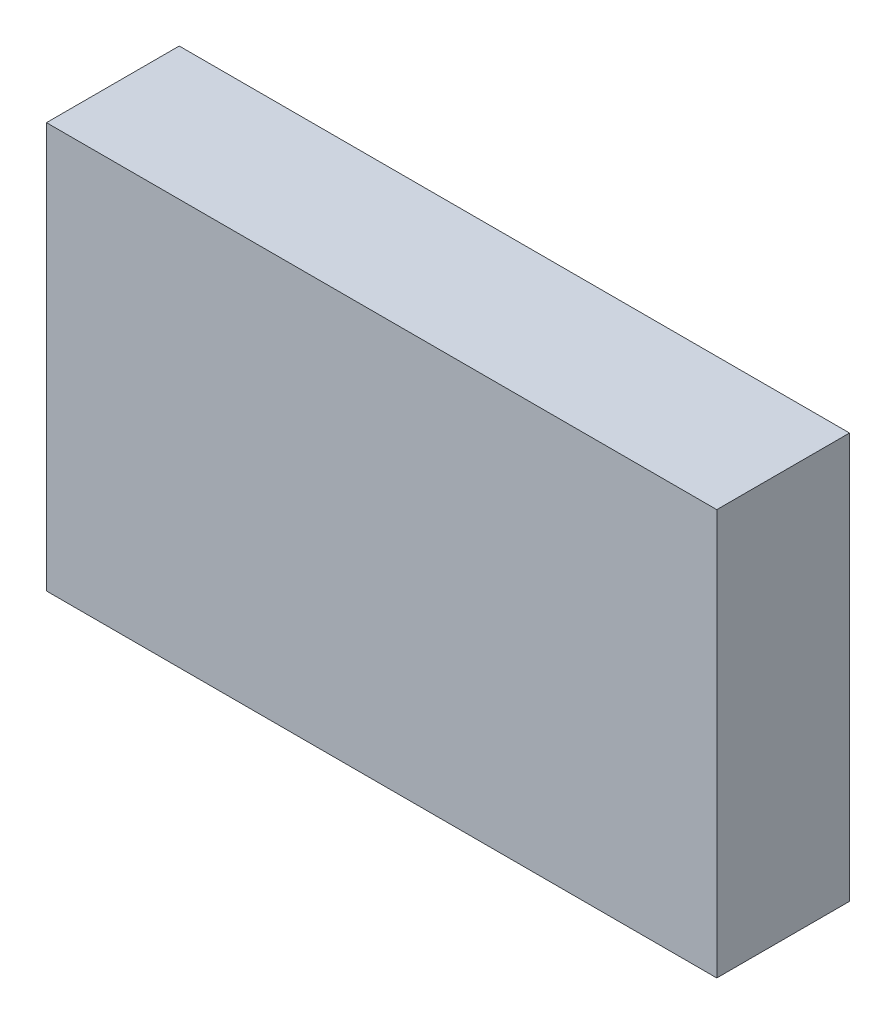
ISO-10303-21;
HEADER;
FILE_DESCRIPTION(('STEP AP214'),'2;1');
FILE_NAME('part.step','',(''),(''),'','','');
FILE_SCHEMA(('AUTOMOTIVE_DESIGN { 1 0 10303 214 1 1 1 1 }'));
ENDSEC;
DATA;
#1=APPLICATION_CONTEXT('core data for automotive mechanical design processes');
#2=APPLICATION_PROTOCOL_DEFINITION('international standard','automotive_design',2000,#1);
#3=PRODUCT_CONTEXT('',#1,'mechanical');
#4=PRODUCT('Part','Part','',(#3));
#5=PRODUCT_RELATED_PRODUCT_CATEGORY('part','',(#4));
#6=PRODUCT_DEFINITION_FORMATION('','',#4);
#7=PRODUCT_DEFINITION_CONTEXT('part definition',#1,'design');
#8=PRODUCT_DEFINITION('design','',#6,#7);
#9=PRODUCT_DEFINITION_SHAPE('','',#8);
#10=(LENGTH_UNIT() NAMED_UNIT(*) SI_UNIT(.MILLI.,.METRE.));
#11=(NAMED_UNIT(*) PLANE_ANGLE_UNIT() SI_UNIT($,.RADIAN.));
#12=(NAMED_UNIT(*) SI_UNIT($,.STERADIAN.) SOLID_ANGLE_UNIT());
#13=UNCERTAINTY_MEASURE_WITH_UNIT(LENGTH_MEASURE(1.E-05),#10,'distance_accuracy_value','');
#14=(GEOMETRIC_REPRESENTATION_CONTEXT(3) GLOBAL_UNCERTAINTY_ASSIGNED_CONTEXT((#13)) GLOBAL_UNIT_ASSIGNED_CONTEXT((#10,
#11,#12)) REPRESENTATION_CONTEXT('',''));
#15=CARTESIAN_POINT('',(0.,0.,0.));
#16=DIRECTION('',(0.,0.,1.));
#17=DIRECTION('',(1.,0.,0.));
#18=AXIS2_PLACEMENT_3D('',#15,#16,#17);
#19=CARTESIAN_POINT('',(0.,0.,16.2));
#20=DIRECTION('',(1.,0.,0.));
#21=DIRECTION('',(0.,0.,-1.));
#22=AXIS2_PLACEMENT_3D('',#19,#20,#21);
#23=PLANE('',#22);
#24=DIRECTION('',(0.,-1.,0.));
#25=VECTOR('',#24,1.);
#26=CARTESIAN_POINT('',(0.,0.,0.));
#27=LINE('',#26,#25);
#28=CARTESIAN_POINT('',(0.,49.5,0.));
#29=VERTEX_POINT('',#28);
#30=CARTESIAN_POINT('',(0.,0.,0.));
#31=VERTEX_POINT('',#30);
#32=EDGE_CURVE('E107',#29,#31,#27,.T.);
#33=ORIENTED_EDGE('',*,*,#32,.T.);
#34=DIRECTION('',(0.,0.,-1.));
#35=VECTOR('',#34,1.);
#36=CARTESIAN_POINT('',(0.,0.,16.2));
#37=LINE('',#36,#35);
#38=CARTESIAN_POINT('',(0.,0.,16.2));
#39=VERTEX_POINT('',#38);
#40=EDGE_CURVE('E11',#39,#31,#37,.T.);
#41=ORIENTED_EDGE('',*,*,#40,.F.);
#42=DIRECTION('',(0.,-1.,0.));
#43=VECTOR('',#42,1.);
#44=CARTESIAN_POINT('',(0.,0.,16.2));
#45=LINE('',#44,#43);
#46=CARTESIAN_POINT('',(0.,49.5,16.2));
#47=VERTEX_POINT('',#46);
#48=EDGE_CURVE('E91',#47,#39,#45,.T.);
#49=ORIENTED_EDGE('',*,*,#48,.F.);
#50=DIRECTION('',(0.,0.,-1.));
#51=VECTOR('',#50,1.);
#52=CARTESIAN_POINT('',(0.,49.5,16.2));
#53=LINE('',#52,#51);
#54=EDGE_CURVE('E103',#47,#29,#53,.T.);
#55=ORIENTED_EDGE('',*,*,#54,.T.);
#56=EDGE_LOOP('',(#33,#41,#49,#55));
#57=FACE_BOUND('',#56,.T.);
#58=ADVANCED_FACE('F39',(#57),#23,.F.);
#59=CARTESIAN_POINT('',(0.,0.,16.2));
#60=DIRECTION('',(0.,1.,0.));
#61=DIRECTION('',(0.,0.,1.));
#62=AXIS2_PLACEMENT_3D('',#59,#60,#61);
#63=PLANE('',#62);
#64=DIRECTION('',(1.,0.,0.));
#65=VECTOR('',#64,1.);
#66=CARTESIAN_POINT('',(0.,0.,0.));
#67=LINE('',#66,#65);
#68=CARTESIAN_POINT('',(81.8,0.,0.));
#69=VERTEX_POINT('',#68);
#70=EDGE_CURVE('E96',#31,#69,#67,.T.);
#71=ORIENTED_EDGE('',*,*,#70,.T.);
#72=DIRECTION('',(0.,0.,-1.));
#73=VECTOR('',#72,1.);
#74=CARTESIAN_POINT('',(81.8,0.,16.2));
#75=LINE('',#74,#73);
#76=CARTESIAN_POINT('',(81.8,0.,16.2));
#77=VERTEX_POINT('',#76);
#78=EDGE_CURVE('E48',#77,#69,#75,.T.);
#79=ORIENTED_EDGE('',*,*,#78,.F.);
#80=DIRECTION('',(1.,0.,0.));
#81=VECTOR('',#80,1.);
#82=CARTESIAN_POINT('',(0.,0.,16.2));
#83=LINE('',#82,#81);
#84=EDGE_CURVE('E86',#39,#77,#83,.T.);
#85=ORIENTED_EDGE('',*,*,#84,.F.);
#86=ORIENTED_EDGE('',*,*,#40,.T.);
#87=EDGE_LOOP('',(#71,#79,#85,#86));
#88=FACE_BOUND('',#87,.T.);
#89=ADVANCED_FACE('F95',(#88),#63,.F.);
#90=CARTESIAN_POINT('',(81.8,0.,16.2));
#91=DIRECTION('',(-1.,0.,0.));
#92=DIRECTION('',(0.,0.,1.));
#93=AXIS2_PLACEMENT_3D('',#90,#91,#92);
#94=PLANE('',#93);
#95=DIRECTION('',(0.,1.,0.));
#96=VECTOR('',#95,1.);
#97=CARTESIAN_POINT('',(81.8,0.,0.));
#98=LINE('',#97,#96);
#99=CARTESIAN_POINT('',(81.8,49.5,0.));
#100=VERTEX_POINT('',#99);
#101=EDGE_CURVE('E73',#69,#100,#98,.T.);
#102=ORIENTED_EDGE('',*,*,#101,.T.);
#103=DIRECTION('',(0.,0.,-1.));
#104=VECTOR('',#103,1.);
#105=CARTESIAN_POINT('',(81.8,49.5,16.2));
#106=LINE('',#105,#104);
#107=CARTESIAN_POINT('',(81.8,49.5,16.2));
#108=VERTEX_POINT('',#107);
#109=EDGE_CURVE('E98',#108,#100,#106,.T.);
#110=ORIENTED_EDGE('',*,*,#109,.F.);
#111=DIRECTION('',(0.,1.,0.));
#112=VECTOR('',#111,1.);
#113=CARTESIAN_POINT('',(81.8,0.,16.2));
#114=LINE('',#113,#112);
#115=EDGE_CURVE('E89',#77,#108,#114,.T.);
#116=ORIENTED_EDGE('',*,*,#115,.F.);
#117=ORIENTED_EDGE('',*,*,#78,.T.);
#118=EDGE_LOOP('',(#102,#110,#116,#117));
#119=FACE_BOUND('',#118,.T.);
#120=ADVANCED_FACE('F99',(#119),#94,.F.);
#121=CARTESIAN_POINT('',(0.,49.5,16.2));
#122=DIRECTION('',(0.,-1.,0.));
#123=DIRECTION('',(0.,0.,-1.));
#124=AXIS2_PLACEMENT_3D('',#121,#122,#123);
#125=PLANE('',#124);
#126=DIRECTION('',(-1.,0.,0.));
#127=VECTOR('',#126,1.);
#128=CARTESIAN_POINT('',(0.,49.5,0.));
#129=LINE('',#128,#127);
#130=EDGE_CURVE('E79',#100,#29,#129,.T.);
#131=ORIENTED_EDGE('',*,*,#130,.T.);
#132=ORIENTED_EDGE('',*,*,#54,.F.);
#133=DIRECTION('',(-1.,0.,0.));
#134=VECTOR('',#133,1.);
#135=CARTESIAN_POINT('',(0.,49.5,16.2));
#136=LINE('',#135,#134);
#137=EDGE_CURVE('E56',#108,#47,#136,.T.);
#138=ORIENTED_EDGE('',*,*,#137,.F.);
#139=ORIENTED_EDGE('',*,*,#109,.T.);
#140=EDGE_LOOP('',(#131,#132,#138,#139));
#141=FACE_BOUND('',#140,.T.);
#142=ADVANCED_FACE('F120',(#141),#125,.F.);
#143=CARTESIAN_POINT('',(0.,0.,16.2));
#144=DIRECTION('',(0.,0.,-1.));
#145=DIRECTION('',(-1.,0.,0.));
#146=AXIS2_PLACEMENT_3D('',#143,#144,#145);
#147=PLANE('',#146);
#148=ORIENTED_EDGE('',*,*,#48,.T.);
#149=ORIENTED_EDGE('',*,*,#84,.T.);
#150=ORIENTED_EDGE('',*,*,#115,.T.);
#151=ORIENTED_EDGE('',*,*,#137,.T.);
#152=EDGE_LOOP('',(#148,#149,#150,#151));
#153=FACE_BOUND('',#152,.T.);
#154=ADVANCED_FACE('F87',(#153),#147,.F.);
#155=CARTESIAN_POINT('',(0.,0.,0.));
#156=DIRECTION('',(0.,0.,-1.));
#157=DIRECTION('',(-1.,0.,0.));
#158=AXIS2_PLACEMENT_3D('',#155,#156,#157);
#159=PLANE('',#158);
#160=ORIENTED_EDGE('',*,*,#32,.F.);
#161=ORIENTED_EDGE('',*,*,#130,.F.);
#162=ORIENTED_EDGE('',*,*,#101,.F.);
#163=ORIENTED_EDGE('',*,*,#70,.F.);
#164=EDGE_LOOP('',(#160,#161,#162,#163));
#165=FACE_BOUND('',#164,.T.);
#166=ADVANCED_FACE('F123',(#165),#159,.T.);
#167=CLOSED_SHELL('',(#58,#89,#120,#142,#154,#166));
#168=MANIFOLD_SOLID_BREP('B2',#167);
#169=ADVANCED_BREP_SHAPE_REPRESENTATION('',(#18,#168),#14);
#170=SHAPE_DEFINITION_REPRESENTATION(#9,#169);
ENDSEC;
END-ISO-10303-21;
